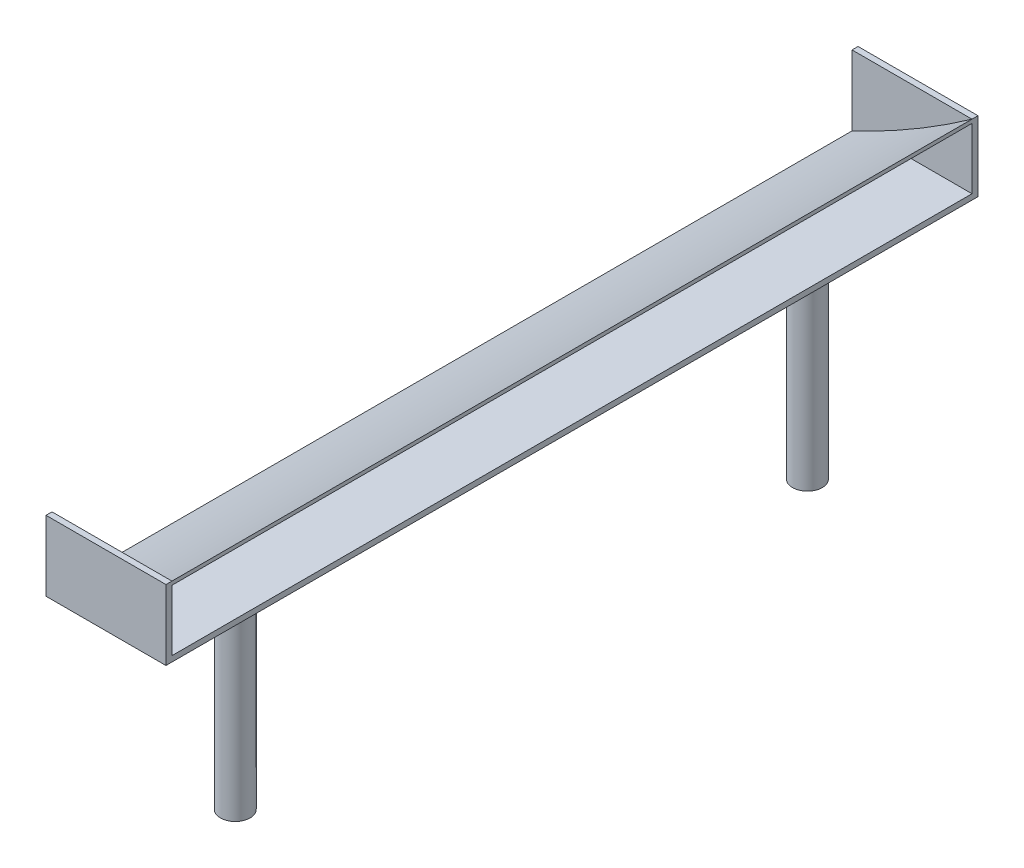
ISO-10303-21;
HEADER;
FILE_DESCRIPTION(('STEP AP214'),'2;1');
FILE_NAME('part.step','',(''),(''),'','','');
FILE_SCHEMA(('AUTOMOTIVE_DESIGN { 1 0 10303 214 1 1 1 1 }'));
ENDSEC;
DATA;
#1=APPLICATION_CONTEXT('core data for automotive mechanical design processes');
#2=APPLICATION_PROTOCOL_DEFINITION('international standard','automotive_design',2000,#1);
#3=PRODUCT_CONTEXT('',#1,'mechanical');
#4=PRODUCT('Part','Part','',(#3));
#5=PRODUCT_RELATED_PRODUCT_CATEGORY('part','',(#4));
#6=PRODUCT_DEFINITION_FORMATION('','',#4);
#7=PRODUCT_DEFINITION_CONTEXT('part definition',#1,'design');
#8=PRODUCT_DEFINITION('design','',#6,#7);
#9=PRODUCT_DEFINITION_SHAPE('','',#8);
#10=(LENGTH_UNIT() NAMED_UNIT(*) SI_UNIT(.MILLI.,.METRE.));
#11=(NAMED_UNIT(*) PLANE_ANGLE_UNIT() SI_UNIT($,.RADIAN.));
#12=(NAMED_UNIT(*) SI_UNIT($,.STERADIAN.) SOLID_ANGLE_UNIT());
#13=UNCERTAINTY_MEASURE_WITH_UNIT(LENGTH_MEASURE(1.E-05),#10,'distance_accuracy_value','');
#14=(GEOMETRIC_REPRESENTATION_CONTEXT(3) GLOBAL_UNCERTAINTY_ASSIGNED_CONTEXT((#13)) GLOBAL_UNIT_ASSIGNED_CONTEXT((#10,
#11,#12)) REPRESENTATION_CONTEXT('',''));
#15=CARTESIAN_POINT('',(0.,0.,0.));
#16=DIRECTION('',(0.,0.,1.));
#17=DIRECTION('',(1.,0.,0.));
#18=AXIS2_PLACEMENT_3D('',#15,#16,#17);
#19=CARTESIAN_POINT('',(-43.5708416248379,-4.53492433238109,-672.));
#20=DIRECTION('',(0.,-1.,0.));
#21=DIRECTION('',(0.,0.,-1.));
#22=AXIS2_PLACEMENT_3D('',#19,#20,#21);
#23=PLANE('',#22);
#24=CARTESIAN_POINT('',(72.0431587763746,-4.53492433238109,472.));
#25=DIRECTION('',(0.,-1.,0.));
#26=DIRECTION('',(0.,0.,-1.));
#27=AXIS2_PLACEMENT_3D('',#24,#25,#26);
#28=CIRCLE('',#27,24.75);
#29=CARTESIAN_POINT('',(72.0431587763746,-4.53492433238109,447.25));
#30=VERTEX_POINT('',#29);
#31=EDGE_CURVE('E202',#30,#30,#28,.T.);
#32=ORIENTED_EDGE('',*,*,#31,.F.);
#33=EDGE_LOOP('',(#32));
#34=FACE_BOUND('',#33,.T.);
#35=DIRECTION('',(0.,0.,1.));
#36=VECTOR('',#35,1.);
#37=CARTESIAN_POINT('',(-10.1828897800269,-4.53492433238109,-682.));
#38=LINE('',#37,#36);
#39=CARTESIAN_POINT('',(-10.1828897800269,-4.53492433238109,-672.));
#40=VERTEX_POINT('',#39);
#41=CARTESIAN_POINT('',(-10.1828897800269,-4.53492433238109,662.));
#42=VERTEX_POINT('',#41);
#43=EDGE_CURVE('E204',#40,#42,#38,.T.);
#44=ORIENTED_EDGE('',*,*,#43,.F.);
#45=DIRECTION('',(-1.,0.,0.));
#46=VECTOR('',#45,1.);
#47=CARTESIAN_POINT('',(156.429158375162,-4.53492433238109,-672.));
#48=LINE('',#47,#46);
#49=CARTESIAN_POINT('',(-36.7183415565687,-4.53492433238109,-672.));
#50=VERTEX_POINT('',#49);
#51=EDGE_CURVE('E147',#40,#50,#48,.T.);
#52=ORIENTED_EDGE('',*,*,#51,.T.);
#53=DIRECTION('',(0.,0.,1.));
#54=VECTOR('',#53,1.);
#55=CARTESIAN_POINT('',(-36.7183415565687,-4.53492433238109,-672.));
#56=LINE('',#55,#54);
#57=CARTESIAN_POINT('',(-36.7183415565687,-4.53492433238109,662.));
#58=VERTEX_POINT('',#57);
#59=EDGE_CURVE('E156',#50,#58,#56,.T.);
#60=ORIENTED_EDGE('',*,*,#59,.T.);
#61=DIRECTION('',(1.,0.,0.));
#62=VECTOR('',#61,1.);
#63=CARTESIAN_POINT('',(-43.5708416248379,-4.53492433238109,662.));
#64=LINE('',#63,#62);
#65=EDGE_CURVE('E208',#58,#42,#64,.T.);
#66=ORIENTED_EDGE('',*,*,#65,.T.);
#67=EDGE_LOOP('',(#44,#52,#60,#66));
#68=FACE_BOUND('',#67,.T.);
#69=DIRECTION('',(0.,0.,1.));
#70=VECTOR('',#69,1.);
#71=CARTESIAN_POINT('',(156.429158375162,-4.53492433238109,662.));
#72=LINE('',#71,#70);
#73=CARTESIAN_POINT('',(156.429158375162,-4.53492433238109,-682.));
#74=VERTEX_POINT('',#73);
#75=CARTESIAN_POINT('',(156.429158375162,-4.53492433238109,672.));
#76=VERTEX_POINT('',#75);
#77=EDGE_CURVE('E258',#74,#76,#72,.T.);
#78=ORIENTED_EDGE('',*,*,#77,.T.);
#79=DIRECTION('',(1.,0.,0.));
#80=VECTOR('',#79,1.);
#81=CARTESIAN_POINT('',(-43.5708416248379,-4.53492433238109,672.));
#82=LINE('',#81,#80);
#83=CARTESIAN_POINT('',(-43.5708416248379,-4.53492433238109,672.));
#84=VERTEX_POINT('',#83);
#85=EDGE_CURVE('E165',#84,#76,#82,.T.);
#86=ORIENTED_EDGE('',*,*,#85,.F.);
#87=DIRECTION('',(0.,0.,1.));
#88=VECTOR('',#87,1.);
#89=CARTESIAN_POINT('',(-43.5708416248379,-4.53492433238109,662.));
#90=LINE('',#89,#88);
#91=CARTESIAN_POINT('',(-43.5708416248379,-4.53492433238109,661.999999999999));
#92=VERTEX_POINT('',#91);
#93=EDGE_CURVE('E153',#92,#84,#90,.T.);
#94=ORIENTED_EDGE('',*,*,#93,.F.);
#95=DIRECTION('',(0.,0.,1.));
#96=VECTOR('',#95,1.);
#97=CARTESIAN_POINT('',(-43.5708416248379,-4.53492433238109,-672.));
#98=LINE('',#97,#96);
#99=CARTESIAN_POINT('',(-43.5708416248379,-4.53492433238109,-672.));
#100=VERTEX_POINT('',#99);
#101=EDGE_CURVE('E150',#100,#92,#98,.T.);
#102=ORIENTED_EDGE('',*,*,#101,.F.);
#103=DIRECTION('',(0.,0.,-1.));
#104=VECTOR('',#103,1.);
#105=CARTESIAN_POINT('',(-43.5708416248379,-4.53492433238109,-672.));
#106=LINE('',#105,#104);
#107=CARTESIAN_POINT('',(-43.5708416248379,-4.53492433238109,-682.));
#108=VERTEX_POINT('',#107);
#109=EDGE_CURVE('E128',#100,#108,#106,.T.);
#110=ORIENTED_EDGE('',*,*,#109,.T.);
#111=DIRECTION('',(-1.,0.,0.));
#112=VECTOR('',#111,1.);
#113=CARTESIAN_POINT('',(156.429158375162,-4.53492433238109,-682.));
#114=LINE('',#113,#112);
#115=EDGE_CURVE('E237',#74,#108,#114,.T.);
#116=ORIENTED_EDGE('',*,*,#115,.F.);
#117=EDGE_LOOP('',(#78,#86,#94,#102,#110,#116));
#118=FACE_BOUND('',#117,.T.);
#119=CARTESIAN_POINT('',(72.0431587763746,-4.53492433238109,-482.));
#120=DIRECTION('',(0.,-1.,0.));
#121=DIRECTION('',(0.,0.,-1.));
#122=AXIS2_PLACEMENT_3D('',#119,#120,#121);
#123=CIRCLE('',#122,24.75);
#124=CARTESIAN_POINT('',(72.0431587763746,-4.53492433238109,-506.75));
#125=VERTEX_POINT('',#124);
#126=EDGE_CURVE('E504',#125,#125,#123,.T.);
#127=ORIENTED_EDGE('',*,*,#126,.F.);
#128=EDGE_LOOP('',(#127));
#129=FACE_BOUND('',#128,.T.);
#130=ADVANCED_FACE('F39',(#34,#68,#118,#129),#23,.T.);
#131=CARTESIAN_POINT('',(0.,0.,662.));
#132=DIRECTION('',(0.,0.,1.));
#133=DIRECTION('',(1.,0.,0.));
#134=AXIS2_PLACEMENT_3D('',#131,#132,#133);
#135=PLANE('',#134);
#136=DIRECTION('',(0.,1.,0.));
#137=VECTOR('',#136,1.);
#138=CARTESIAN_POINT('',(-10.1828897800269,-4.53492433238109,662.));
#139=LINE('',#138,#137);
#140=CARTESIAN_POINT('',(-10.1828897800269,4.72903523623304,662.));
#141=VERTEX_POINT('',#140);
#142=EDGE_CURVE('E238',#42,#141,#139,.T.);
#143=ORIENTED_EDGE('',*,*,#142,.F.);
#144=ORIENTED_EDGE('',*,*,#65,.F.);
#145=CARTESIAN_POINT('',(-36.7183415565687,-4.53492433238109,662.));
#146=CARTESIAN_POINT('',(65.3430742746029,41.2659049004114,662.));
#147=CARTESIAN_POINT('',(156.429158375162,106.329308799927,662.));
#148=B_SPLINE_CURVE_WITH_KNOTS('',2,(#145,#146,#147),.UNSPECIFIED.,.F.,.F.,(3,3),(0.,1.),.UNSPECIFIED.);
#149=CARTESIAN_POINT('',(156.429158375162,106.329308799927,662.));
#150=VERTEX_POINT('',#149);
#151=EDGE_CURVE('E261',#150,#58,#148,.F.);
#152=ORIENTED_EDGE('',*,*,#151,.F.);
#153=DIRECTION('',(0.,1.,0.));
#154=VECTOR('',#153,1.);
#155=CARTESIAN_POINT('',(156.429158375162,-4.53492433238109,662.));
#156=LINE('',#155,#154);
#157=CARTESIAN_POINT('',(156.429158375162,4.72903523623304,662.));
#158=VERTEX_POINT('',#157);
#159=EDGE_CURVE('E247',#158,#150,#156,.T.);
#160=ORIENTED_EDGE('',*,*,#159,.F.);
#161=DIRECTION('',(-1.,0.,0.));
#162=VECTOR('',#161,1.);
#163=CARTESIAN_POINT('',(156.429158375162,4.72903523623304,662.));
#164=LINE('',#163,#162);
#165=EDGE_CURVE('E234',#158,#141,#164,.T.);
#166=ORIENTED_EDGE('',*,*,#165,.T.);
#167=EDGE_LOOP('',(#143,#144,#152,#160,#166));
#168=FACE_BOUND('',#167,.T.);
#169=ADVANCED_FACE('F191',(#168),#135,.F.);
#170=CARTESIAN_POINT('',(156.429158375162,112.402005818465,-672.));
#171=CARTESIAN_POINT('',(61.566048455508,45.1249728586423,-672.));
#172=CARTESIAN_POINT('',(-43.5708416248379,-4.53492433238109,-672.));
#173=B_SPLINE_CURVE_WITH_KNOTS('',2,(#170,#171,#172),.UNSPECIFIED.,.F.,.F.,(3,3),(0.,1.),.UNSPECIFIED.);
#174=DIRECTION('',(0.,0.,1.));
#175=VECTOR('',#174,1.);
#176=SURFACE_OF_LINEAR_EXTRUSION('',#173,#175);
#177=ORIENTED_EDGE('',*,*,#101,.T.);
#178=CARTESIAN_POINT('',(156.429158375162,112.402005818465,662.));
#179=CARTESIAN_POINT('',(61.566048455508,45.1249728586423,662.));
#180=CARTESIAN_POINT('',(-43.5708416248379,-4.53492433238109,662.));
#181=B_SPLINE_CURVE_WITH_KNOTS('',2,(#178,#179,#180),.UNSPECIFIED.,.F.,.F.,(3,3),(0.,1.),.UNSPECIFIED.);
#182=CARTESIAN_POINT('',(156.429158375162,112.402005818465,661.999999999999));
#183=VERTEX_POINT('',#182);
#184=EDGE_CURVE('E266',#92,#183,#181,.F.);
#185=ORIENTED_EDGE('',*,*,#184,.T.);
#186=DIRECTION('',(0.,0.,1.));
#187=VECTOR('',#186,1.);
#188=CARTESIAN_POINT('',(156.429158375162,112.402005818465,-672.));
#189=LINE('',#188,#187);
#190=CARTESIAN_POINT('',(156.429158375162,112.402005818465,-672.));
#191=VERTEX_POINT('',#190);
#192=EDGE_CURVE('E48',#191,#183,#189,.T.);
#193=ORIENTED_EDGE('',*,*,#192,.F.);
#194=EDGE_CURVE('E144',#191,#100,#173,.T.);
#195=ORIENTED_EDGE('',*,*,#194,.T.);
#196=EDGE_LOOP('',(#177,#185,#193,#195));
#197=FACE_BOUND('',#196,.T.);
#198=ADVANCED_FACE('F41',(#197),#176,.T.);
#199=CARTESIAN_POINT('',(-36.7183415565687,-4.53492433238109,-672.));
#200=CARTESIAN_POINT('',(65.3430742746029,41.2659049004114,-672.));
#201=CARTESIAN_POINT('',(156.429158375162,106.329308799927,-672.));
#202=B_SPLINE_CURVE_WITH_KNOTS('',2,(#199,#200,#201),.UNSPECIFIED.,.F.,.F.,(3,3),(0.,1.),.UNSPECIFIED.);
#203=DIRECTION('',(0.,0.,1.));
#204=VECTOR('',#203,1.);
#205=SURFACE_OF_LINEAR_EXTRUSION('',#202,#204);
#206=DIRECTION('',(0.,0.,1.));
#207=VECTOR('',#206,1.);
#208=CARTESIAN_POINT('',(156.429158375162,106.329308799927,-672.));
#209=LINE('',#208,#207);
#210=CARTESIAN_POINT('',(156.429158375162,106.329308799927,-672.));
#211=VERTEX_POINT('',#210);
#212=EDGE_CURVE('E306',#211,#150,#209,.T.);
#213=ORIENTED_EDGE('',*,*,#212,.T.);
#214=ORIENTED_EDGE('',*,*,#151,.T.);
#215=ORIENTED_EDGE('',*,*,#59,.F.);
#216=EDGE_CURVE('E157',#50,#211,#202,.T.);
#217=ORIENTED_EDGE('',*,*,#216,.T.);
#218=EDGE_LOOP('',(#213,#214,#215,#217));
#219=FACE_BOUND('',#218,.T.);
#220=ADVANCED_FACE('F184',(#219),#205,.T.);
#221=CARTESIAN_POINT('',(156.429158375162,112.402005818465,-672.));
#222=DIRECTION('',(1.,0.,0.));
#223=DIRECTION('',(0.,0.,-1.));
#224=AXIS2_PLACEMENT_3D('',#221,#222,#223);
#225=PLANE('',#224);
#226=DIRECTION('',(0.,1.,0.));
#227=VECTOR('',#226,1.);
#228=CARTESIAN_POINT('',(156.429158375162,112.402005818465,672.));
#229=LINE('',#228,#227);
#230=CARTESIAN_POINT('',(156.429158375162,112.402005818465,672.));
#231=VERTEX_POINT('',#230);
#232=EDGE_CURVE('E161',#76,#231,#229,.T.);
#233=ORIENTED_EDGE('',*,*,#232,.F.);
#234=ORIENTED_EDGE('',*,*,#77,.F.);
#235=DIRECTION('',(0.,1.,0.));
#236=VECTOR('',#235,1.);
#237=CARTESIAN_POINT('',(156.429158375162,-4.53492433238109,-682.));
#238=LINE('',#237,#236);
#239=CARTESIAN_POINT('',(156.429158375162,112.402005818465,-682.));
#240=VERTEX_POINT('',#239);
#241=EDGE_CURVE('E235',#74,#240,#238,.T.);
#242=ORIENTED_EDGE('',*,*,#241,.T.);
#243=DIRECTION('',(0.,0.,-1.));
#244=VECTOR('',#243,1.);
#245=CARTESIAN_POINT('',(156.429158375162,112.402005818465,-672.));
#246=LINE('',#245,#244);
#247=EDGE_CURVE('E229',#191,#240,#246,.T.);
#248=ORIENTED_EDGE('',*,*,#247,.F.);
#249=ORIENTED_EDGE('',*,*,#192,.T.);
#250=DIRECTION('',(0.,0.,1.));
#251=VECTOR('',#250,1.);
#252=CARTESIAN_POINT('',(156.429158375162,112.402005818465,662.));
#253=LINE('',#252,#251);
#254=EDGE_CURVE('E257',#183,#231,#253,.T.);
#255=ORIENTED_EDGE('',*,*,#254,.T.);
#256=EDGE_LOOP('',(#233,#234,#242,#248,#249,#255));
#257=FACE_BOUND('',#256,.T.);
#258=DIRECTION('',(0.,-1.,0.));
#259=VECTOR('',#258,1.);
#260=CARTESIAN_POINT('',(156.429158375162,-4.53492433238109,-672.));
#261=LINE('',#260,#259);
#262=CARTESIAN_POINT('',(156.429158375162,4.72903523623304,-672.));
#263=VERTEX_POINT('',#262);
#264=EDGE_CURVE('E217',#211,#263,#261,.T.);
#265=ORIENTED_EDGE('',*,*,#264,.T.);
#266=DIRECTION('',(0.,0.,1.));
#267=VECTOR('',#266,1.);
#268=CARTESIAN_POINT('',(156.429158375162,4.72903523623304,-682.));
#269=LINE('',#268,#267);
#270=EDGE_CURVE('E240',#263,#158,#269,.T.);
#271=ORIENTED_EDGE('',*,*,#270,.T.);
#272=ORIENTED_EDGE('',*,*,#159,.T.);
#273=ORIENTED_EDGE('',*,*,#212,.F.);
#274=EDGE_LOOP('',(#265,#271,#272,#273));
#275=FACE_BOUND('',#274,.T.);
#276=ADVANCED_FACE('F187',(#257,#275),#225,.T.);
#277=CARTESIAN_POINT('',(58.9976034153351,49.529256800842,672.));
#278=DIRECTION('',(0.,0.,-1.));
#279=DIRECTION('',(-1.,0.,0.));
#280=AXIS2_PLACEMENT_3D('',#277,#278,#279);
#281=PLANE('',#280);
#282=ORIENTED_EDGE('',*,*,#232,.T.);
#283=DIRECTION('',(1.,0.,0.));
#284=VECTOR('',#283,1.);
#285=CARTESIAN_POINT('',(-43.5708416248379,112.402005818465,672.));
#286=LINE('',#285,#284);
#287=CARTESIAN_POINT('',(-43.5708416248379,112.402005818465,672.));
#288=VERTEX_POINT('',#287);
#289=EDGE_CURVE('E211',#288,#231,#286,.T.);
#290=ORIENTED_EDGE('',*,*,#289,.F.);
#291=DIRECTION('',(0.,1.,0.));
#292=VECTOR('',#291,1.);
#293=CARTESIAN_POINT('',(-43.5708416248379,-4.53492433238109,672.));
#294=LINE('',#293,#292);
#295=EDGE_CURVE('E248',#84,#288,#294,.T.);
#296=ORIENTED_EDGE('',*,*,#295,.F.);
#297=ORIENTED_EDGE('',*,*,#85,.T.);
#298=EDGE_LOOP('',(#282,#290,#296,#297));
#299=FACE_BOUND('',#298,.T.);
#300=ADVANCED_FACE('F298',(#299),#281,.F.);
#301=CARTESIAN_POINT('',(-43.5708416248379,112.402005818465,662.));
#302=DIRECTION('',(0.,-1.,0.));
#303=DIRECTION('',(0.,0.,-1.));
#304=AXIS2_PLACEMENT_3D('',#301,#302,#303);
#305=PLANE('',#304);
#306=ORIENTED_EDGE('',*,*,#289,.T.);
#307=ORIENTED_EDGE('',*,*,#254,.F.);
#308=DIRECTION('',(1.,0.,0.));
#309=VECTOR('',#308,1.);
#310=CARTESIAN_POINT('',(-43.5708416248379,112.402005818465,662.));
#311=LINE('',#310,#309);
#312=CARTESIAN_POINT('',(-43.5708416248379,112.402005818465,662.));
#313=VERTEX_POINT('',#312);
#314=EDGE_CURVE('E250',#313,#183,#311,.T.);
#315=ORIENTED_EDGE('',*,*,#314,.F.);
#316=DIRECTION('',(0.,0.,1.));
#317=VECTOR('',#316,1.);
#318=CARTESIAN_POINT('',(-43.5708416248379,112.402005818465,662.));
#319=LINE('',#318,#317);
#320=EDGE_CURVE('E254',#313,#288,#319,.T.);
#321=ORIENTED_EDGE('',*,*,#320,.T.);
#322=EDGE_LOOP('',(#306,#307,#315,#321));
#323=FACE_BOUND('',#322,.T.);
#324=ADVANCED_FACE('F300',(#323),#305,.F.);
#325=CARTESIAN_POINT('',(-43.5708416248379,-4.53492433238109,662.));
#326=DIRECTION('',(1.,0.,0.));
#327=DIRECTION('',(0.,0.,-1.));
#328=AXIS2_PLACEMENT_3D('',#325,#326,#327);
#329=PLANE('',#328);
#330=ORIENTED_EDGE('',*,*,#295,.T.);
#331=ORIENTED_EDGE('',*,*,#320,.F.);
#332=DIRECTION('',(0.,1.,0.));
#333=VECTOR('',#332,1.);
#334=CARTESIAN_POINT('',(-43.5708416248379,-4.53492433238109,662.));
#335=LINE('',#334,#333);
#336=EDGE_CURVE('E260',#92,#313,#335,.T.);
#337=ORIENTED_EDGE('',*,*,#336,.F.);
#338=ORIENTED_EDGE('',*,*,#93,.T.);
#339=EDGE_LOOP('',(#330,#331,#337,#338));
#340=FACE_BOUND('',#339,.T.);
#341=ADVANCED_FACE('F304',(#340),#329,.F.);
#342=ORIENTED_EDGE('',*,*,#184,.F.);
#343=ORIENTED_EDGE('',*,*,#336,.T.);
#344=ORIENTED_EDGE('',*,*,#314,.T.);
#345=EDGE_LOOP('',(#342,#343,#344));
#346=FACE_BOUND('',#345,.T.);
#347=ADVANCED_FACE('F198',(#346),#135,.F.);
#348=CARTESIAN_POINT('',(-10.1828897800269,-4.53492433238109,-682.));
#349=DIRECTION('',(1.,0.,0.));
#350=DIRECTION('',(0.,0.,-1.));
#351=AXIS2_PLACEMENT_3D('',#348,#349,#350);
#352=PLANE('',#351);
#353=DIRECTION('',(0.,0.,1.));
#354=VECTOR('',#353,1.);
#355=CARTESIAN_POINT('',(-10.1828897800269,4.72903523623304,-682.));
#356=LINE('',#355,#354);
#357=CARTESIAN_POINT('',(-10.1828897800269,4.72903523623304,-672.));
#358=VERTEX_POINT('',#357);
#359=EDGE_CURVE('E212',#358,#141,#356,.T.);
#360=ORIENTED_EDGE('',*,*,#359,.F.);
#361=DIRECTION('',(0.,-1.,0.));
#362=VECTOR('',#361,1.);
#363=CARTESIAN_POINT('',(-10.1828897800269,-4.53492433238109,-672.));
#364=LINE('',#363,#362);
#365=EDGE_CURVE('E55',#358,#40,#364,.T.);
#366=ORIENTED_EDGE('',*,*,#365,.T.);
#367=ORIENTED_EDGE('',*,*,#43,.T.);
#368=ORIENTED_EDGE('',*,*,#142,.T.);
#369=EDGE_LOOP('',(#360,#366,#367,#368));
#370=FACE_BOUND('',#369,.T.);
#371=ADVANCED_FACE('F315',(#370),#352,.F.);
#372=CARTESIAN_POINT('',(156.429158375162,4.72903523623304,-682.));
#373=DIRECTION('',(0.,1.,0.));
#374=DIRECTION('',(0.,0.,1.));
#375=AXIS2_PLACEMENT_3D('',#372,#373,#374);
#376=PLANE('',#375);
#377=DIRECTION('',(1.,0.,0.));
#378=VECTOR('',#377,1.);
#379=CARTESIAN_POINT('',(156.429158375162,4.72903523623304,-672.));
#380=LINE('',#379,#378);
#381=EDGE_CURVE('E11',#358,#263,#380,.T.);
#382=ORIENTED_EDGE('',*,*,#381,.F.);
#383=ORIENTED_EDGE('',*,*,#359,.T.);
#384=ORIENTED_EDGE('',*,*,#165,.F.);
#385=ORIENTED_EDGE('',*,*,#270,.F.);
#386=EDGE_LOOP('',(#382,#383,#384,#385));
#387=FACE_BOUND('',#386,.T.);
#388=ADVANCED_FACE('F316',(#387),#376,.T.);
#389=CARTESIAN_POINT('',(0.,0.,-682.));
#390=DIRECTION('',(0.,0.,1.));
#391=DIRECTION('',(1.,0.,0.));
#392=AXIS2_PLACEMENT_3D('',#389,#390,#391);
#393=PLANE('',#392);
#394=ORIENTED_EDGE('',*,*,#241,.F.);
#395=ORIENTED_EDGE('',*,*,#115,.T.);
#396=DIRECTION('',(0.,1.,0.));
#397=VECTOR('',#396,1.);
#398=CARTESIAN_POINT('',(-43.5708416248379,-4.53492433238109,-682.));
#399=LINE('',#398,#397);
#400=CARTESIAN_POINT('',(-43.5708416248379,112.402005818465,-682.));
#401=VERTEX_POINT('',#400);
#402=EDGE_CURVE('E134',#108,#401,#399,.T.);
#403=ORIENTED_EDGE('',*,*,#402,.T.);
#404=DIRECTION('',(1.,0.,0.));
#405=VECTOR('',#404,1.);
#406=CARTESIAN_POINT('',(156.429158375162,112.402005818465,-682.));
#407=LINE('',#406,#405);
#408=EDGE_CURVE('E220',#401,#240,#407,.T.);
#409=ORIENTED_EDGE('',*,*,#408,.T.);
#410=EDGE_LOOP('',(#394,#395,#403,#409));
#411=FACE_BOUND('',#410,.T.);
#412=ADVANCED_FACE('F318',(#411),#393,.F.);
#413=CARTESIAN_POINT('',(0.,0.,-672.));
#414=DIRECTION('',(0.,0.,1.));
#415=DIRECTION('',(1.,0.,0.));
#416=AXIS2_PLACEMENT_3D('',#413,#414,#415);
#417=PLANE('',#416);
#418=DIRECTION('',(0.,1.,0.));
#419=VECTOR('',#418,1.);
#420=CARTESIAN_POINT('',(-43.5708416248379,-4.53492433238109,-672.));
#421=LINE('',#420,#419);
#422=CARTESIAN_POINT('',(-43.5708416248379,112.402005818465,-672.));
#423=VERTEX_POINT('',#422);
#424=EDGE_CURVE('E131',#100,#423,#421,.T.);
#425=ORIENTED_EDGE('',*,*,#424,.F.);
#426=ORIENTED_EDGE('',*,*,#194,.F.);
#427=DIRECTION('',(1.,0.,0.));
#428=VECTOR('',#427,1.);
#429=CARTESIAN_POINT('',(156.429158375162,112.402005818465,-672.));
#430=LINE('',#429,#428);
#431=EDGE_CURVE('E139',#423,#191,#430,.T.);
#432=ORIENTED_EDGE('',*,*,#431,.F.);
#433=EDGE_LOOP('',(#425,#426,#432));
#434=FACE_BOUND('',#433,.T.);
#435=ADVANCED_FACE('F142',(#434),#417,.T.);
#436=ORIENTED_EDGE('',*,*,#264,.F.);
#437=ORIENTED_EDGE('',*,*,#216,.F.);
#438=ORIENTED_EDGE('',*,*,#51,.F.);
#439=ORIENTED_EDGE('',*,*,#365,.F.);
#440=ORIENTED_EDGE('',*,*,#381,.T.);
#441=EDGE_LOOP('',(#436,#437,#438,#439,#440));
#442=FACE_BOUND('',#441,.T.);
#443=ADVANCED_FACE('F215',(#442),#417,.T.);
#444=CARTESIAN_POINT('',(156.429158375162,112.402005818465,-672.));
#445=DIRECTION('',(0.,1.,0.));
#446=DIRECTION('',(0.,0.,1.));
#447=AXIS2_PLACEMENT_3D('',#444,#445,#446);
#448=PLANE('',#447);
#449=ORIENTED_EDGE('',*,*,#408,.F.);
#450=DIRECTION('',(0.,0.,-1.));
#451=VECTOR('',#450,1.);
#452=CARTESIAN_POINT('',(-43.5708416248379,112.402005818465,-672.));
#453=LINE('',#452,#451);
#454=EDGE_CURVE('E138',#423,#401,#453,.T.);
#455=ORIENTED_EDGE('',*,*,#454,.F.);
#456=ORIENTED_EDGE('',*,*,#431,.T.);
#457=ORIENTED_EDGE('',*,*,#247,.T.);
#458=EDGE_LOOP('',(#449,#455,#456,#457));
#459=FACE_BOUND('',#458,.T.);
#460=ADVANCED_FACE('F426',(#459),#448,.T.);
#461=CARTESIAN_POINT('',(-43.5708416248379,-4.53492433238109,-672.));
#462=DIRECTION('',(-1.,0.,0.));
#463=DIRECTION('',(0.,0.,1.));
#464=AXIS2_PLACEMENT_3D('',#461,#462,#463);
#465=PLANE('',#464);
#466=ORIENTED_EDGE('',*,*,#402,.F.);
#467=ORIENTED_EDGE('',*,*,#109,.F.);
#468=ORIENTED_EDGE('',*,*,#424,.T.);
#469=ORIENTED_EDGE('',*,*,#454,.T.);
#470=EDGE_LOOP('',(#466,#467,#468,#469));
#471=FACE_BOUND('',#470,.T.);
#472=ADVANCED_FACE('F130',(#471),#465,.T.);
#473=CARTESIAN_POINT('',(72.0431587763746,-354.534924332381,472.));
#474=DIRECTION('',(0.,1.,0.));
#475=DIRECTION('',(0.,0.,1.));
#476=AXIS2_PLACEMENT_3D('',#473,#474,#475);
#477=CYLINDRICAL_SURFACE('',#476,24.75);
#478=CARTESIAN_POINT('',(72.0431587763746,-354.534924332381,472.));
#479=DIRECTION('',(0.,-1.,0.));
#480=DIRECTION('',(0.,0.,-1.));
#481=AXIS2_PLACEMENT_3D('',#478,#479,#480);
#482=CIRCLE('',#481,24.75);
#483=CARTESIAN_POINT('',(72.0431587763746,-354.534924332381,447.25));
#484=VERTEX_POINT('',#483);
#485=EDGE_CURVE('E226',#484,#484,#482,.T.);
#486=ORIENTED_EDGE('',*,*,#485,.F.);
#487=EDGE_LOOP('',(#486));
#488=FACE_BOUND('',#487,.T.);
#489=ORIENTED_EDGE('',*,*,#31,.T.);
#490=EDGE_LOOP('',(#489));
#491=FACE_BOUND('',#490,.T.);
#492=ADVANCED_FACE('F441',(#488,#491),#477,.T.);
#493=CARTESIAN_POINT('',(72.0431587763746,-354.534924332381,472.));
#494=DIRECTION('',(0.,-1.,0.));
#495=DIRECTION('',(0.,0.,-1.));
#496=AXIS2_PLACEMENT_3D('',#493,#494,#495);
#497=PLANE('',#496);
#498=ORIENTED_EDGE('',*,*,#485,.T.);
#499=EDGE_LOOP('',(#498));
#500=FACE_BOUND('',#499,.T.);
#501=ADVANCED_FACE('F463',(#500),#497,.T.);
#502=CARTESIAN_POINT('',(72.0431587763746,-354.534924332381,-482.));
#503=DIRECTION('',(0.,1.,0.));
#504=DIRECTION('',(0.,0.,1.));
#505=AXIS2_PLACEMENT_3D('',#502,#503,#504);
#506=CYLINDRICAL_SURFACE('',#505,24.75);
#507=CARTESIAN_POINT('',(72.0431587763746,-354.534924332381,-482.));
#508=DIRECTION('',(0.,-1.,0.));
#509=DIRECTION('',(0.,0.,-1.));
#510=AXIS2_PLACEMENT_3D('',#507,#508,#509);
#511=CIRCLE('',#510,24.75);
#512=CARTESIAN_POINT('',(72.0431587763746,-354.534924332381,-506.75));
#513=VERTEX_POINT('',#512);
#514=EDGE_CURVE('E503',#513,#513,#511,.T.);
#515=ORIENTED_EDGE('',*,*,#514,.F.);
#516=EDGE_LOOP('',(#515));
#517=FACE_BOUND('',#516,.T.);
#518=ORIENTED_EDGE('',*,*,#126,.T.);
#519=EDGE_LOOP('',(#518));
#520=FACE_BOUND('',#519,.T.);
#521=ADVANCED_FACE('F472',(#517,#520),#506,.T.);
#522=CARTESIAN_POINT('',(72.0431587763746,-354.534924332381,-482.));
#523=DIRECTION('',(0.,-1.,0.));
#524=DIRECTION('',(0.,0.,-1.));
#525=AXIS2_PLACEMENT_3D('',#522,#523,#524);
#526=PLANE('',#525);
#527=ORIENTED_EDGE('',*,*,#514,.T.);
#528=EDGE_LOOP('',(#527));
#529=FACE_BOUND('',#528,.T.);
#530=ADVANCED_FACE('F481',(#529),#526,.T.);
#531=CLOSED_SHELL('',(#130,#169,#198,#220,#276,#300,#324,#341,#347,#371,#388,#412,#435,#443,
#460,#472,#492,#501,#521,#530));
#532=MANIFOLD_SOLID_BREP('B2',#531);
#533=ADVANCED_BREP_SHAPE_REPRESENTATION('',(#18,#532),#14);
#534=SHAPE_DEFINITION_REPRESENTATION(#9,#533);
ENDSEC;
END-ISO-10303-21;
